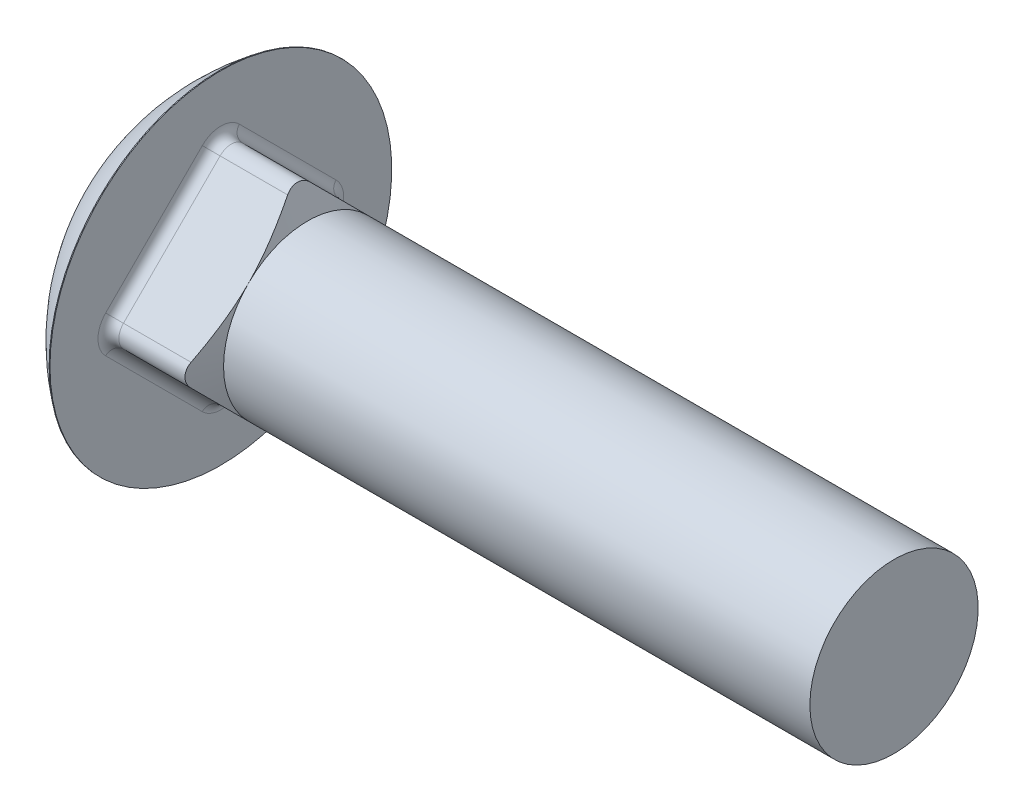
ISO-10303-21;
HEADER;
FILE_DESCRIPTION(('STEP AP214'),'2;1');
FILE_NAME('part.step','',(''),(''),'','','');
FILE_SCHEMA(('AUTOMOTIVE_DESIGN { 1 0 10303 214 1 1 1 1 }'));
ENDSEC;
DATA;
#1=APPLICATION_CONTEXT('core data for automotive mechanical design processes');
#2=APPLICATION_PROTOCOL_DEFINITION('international standard','automotive_design',2000,#1);
#3=PRODUCT_CONTEXT('',#1,'mechanical');
#4=PRODUCT('Part','Part','',(#3));
#5=PRODUCT_RELATED_PRODUCT_CATEGORY('part','',(#4));
#6=PRODUCT_DEFINITION_FORMATION('','',#4);
#7=PRODUCT_DEFINITION_CONTEXT('part definition',#1,'design');
#8=PRODUCT_DEFINITION('design','',#6,#7);
#9=PRODUCT_DEFINITION_SHAPE('','',#8);
#10=(LENGTH_UNIT() NAMED_UNIT(*) SI_UNIT(.MILLI.,.METRE.));
#11=(NAMED_UNIT(*) PLANE_ANGLE_UNIT() SI_UNIT($,.RADIAN.));
#12=(NAMED_UNIT(*) SI_UNIT($,.STERADIAN.) SOLID_ANGLE_UNIT());
#13=UNCERTAINTY_MEASURE_WITH_UNIT(LENGTH_MEASURE(1.E-05),#10,'distance_accuracy_value','');
#14=(GEOMETRIC_REPRESENTATION_CONTEXT(3) GLOBAL_UNCERTAINTY_ASSIGNED_CONTEXT((#13)) GLOBAL_UNIT_ASSIGNED_CONTEXT((#10,
#11,#12)) REPRESENTATION_CONTEXT('',''));
#15=CARTESIAN_POINT('',(0.,0.,0.));
#16=DIRECTION('',(0.,0.,1.));
#17=DIRECTION('',(1.,0.,0.));
#18=AXIS2_PLACEMENT_3D('',#15,#16,#17);
#19=CARTESIAN_POINT('',(26.2128,1.68828815076104,16.2722240913773));
#20=DIRECTION('',(0.,-0.707106781186549,-0.707106781186546));
#21=DIRECTION('',(0.,0.707106781186546,-0.707106781186549));
#22=AXIS2_PLACEMENT_3D('',#19,#20,#21);
#23=PLANE('',#22);
#24=CARTESIAN_POINT('',(24.8807598533623,16.2724240913773,1.68808815076099));
#25=CARTESIAN_POINT('',(24.9601596187108,16.027679443046,1.93283279909226));
#26=CARTESIAN_POINT('',(25.0372964743429,15.7825608306851,2.17795141145319));
#27=CARTESIAN_POINT('',(25.1863519545563,15.2915071602856,2.66900508185271));
#28=CARTESIAN_POINT('',(25.2582700555004,15.0455720229007,2.91494021923757));
#29=CARTESIAN_POINT('',(25.3962596155297,14.5525793097061,3.40793293243218));
#30=CARTESIAN_POINT('',(25.4623241778106,14.3055207611552,3.65499148098311));
#31=CARTESIAN_POINT('',(25.5877245665684,13.8105642338109,4.14994800832737));
#32=CARTESIAN_POINT('',(25.6470605654289,13.5626662766906,4.39784596544769));
#33=CARTESIAN_POINT('',(25.8136481210669,12.8180244249834,5.14248781715494));
#34=CARTESIAN_POINT('',(25.9095878668188,12.3199535127129,5.64055872942537));
#35=CARTESIAN_POINT('',(26.025872648822,11.5708306594036,6.38968158273473));
#36=CARTESIAN_POINT('',(26.0600269092489,11.3208263586745,6.63968588346382));
#37=CARTESIAN_POINT('',(26.1184380522218,10.8202440672077,7.14026817493059));
#38=CARTESIAN_POINT('',(26.142695466792,10.5696661080366,7.39084613410174));
#39=CARTESIAN_POINT('',(26.180348469974,10.073511899722,7.8870003424163));
#40=CARTESIAN_POINT('',(26.1939666672346,9.82794411562072,8.13256812651758));
#41=CARTESIAN_POINT('',(26.2108820586346,9.33663297906274,8.62387926307557));
#42=CARTESIAN_POINT('',(26.2141794189577,9.09088962949669,8.86962261264162));
#43=CARTESIAN_POINT('',(26.2103744175724,8.5994159899527,9.36109625218561));
#44=CARTESIAN_POINT('',(26.2032708897272,8.35368570452874,9.60682653760957));
#45=CARTESIAN_POINT('',(26.1788298938911,7.86247141083385,10.0980408313045));
#46=CARTESIAN_POINT('',(26.1614919867857,7.61698741358286,10.3435248285555));
#47=CARTESIAN_POINT('',(26.1169991090315,7.12672341932991,10.8337888228084));
#48=CARTESIAN_POINT('',(26.0898543861674,6.8819429553056,11.0785692868327));
#49=CARTESIAN_POINT('',(26.026322250456,6.39297863673103,11.5675336054073));
#50=CARTESIAN_POINT('',(25.9899343602927,6.14879481364889,11.8117174284894));
#51=CARTESIAN_POINT('',(25.867943900499,5.41729862688549,12.5432136152528));
#52=CARTESIAN_POINT('',(25.7695138650547,4.93103450402566,13.0294777381127));
#53=CARTESIAN_POINT('',(25.6035912681529,4.21576615242779,13.7447460897105));
#54=CARTESIAN_POINT('',(25.5469072009391,3.98545045550632,13.975061786632));
#55=CARTESIAN_POINT('',(25.4278711488906,3.52559153511491,14.4349207070234));
#56=CARTESIAN_POINT('',(25.3655202303654,3.29604817471245,14.6644640674259));
#57=CARTESIAN_POINT('',(25.2353958013607,2.83637288599368,15.1241393561446));
#58=CARTESIAN_POINT('',(25.1675933613905,2.60624508074445,15.3542671613939));
#59=CARTESIAN_POINT('',(25.0274428082715,2.14666509551387,15.8138471466245));
#60=CARTESIAN_POINT('',(24.955094383002,1.91721296305798,16.0432992790804));
#61=CARTESIAN_POINT('',(24.8807598533623,1.68808815076105,16.2724240913773));
#62=B_SPLINE_CURVE_WITH_KNOTS('',3,(#24,#25,#26,#27,#28,#29,#30,#31,#32,#33,#34,#35,#36,#37,#38,
#39,#40,#41,#42,#43,#44,#45,#46,#47,#48,#49,#50,#51,#52,#53,#54,#55,#56,#57,#58,#59,#60,#61),
.UNSPECIFIED.,.F.,.F.,(4,2,2,2,2,2,2,2,2,2,2,2,2,2,2,2,2,2,4),(0.,1.06534032984694,
2.1307874059939,3.19747357683502,4.26413241335449,6.39581036811954,7.46131492301681,
8.52676219210955,9.56927061595191,10.6117622534725,11.6543707830245,12.6970240498054,
13.7385909163741,14.7802115802637,16.8634229986616,17.8552276649387,18.8468460920229,
19.8441265311481,20.841475517107),.UNSPECIFIED.);
#63=CARTESIAN_POINT('',(24.8808247470218,16.2722240913773,1.68828815076098));
#64=VERTEX_POINT('',#63);
#65=CARTESIAN_POINT('',(26.2128,8.98025612106916,8.98025612106913));
#66=VERTEX_POINT('',#65);
#67=EDGE_CURVE('E51',#64,#66,#62,.T.);
#68=ORIENTED_EDGE('',*,*,#67,.F.);
#69=DIRECTION('',(-1.,0.,0.));
#70=VECTOR('',#69,1.);
#71=CARTESIAN_POINT('',(26.2128,16.2722240913773,1.68828815076098));
#72=LINE('',#71,#70);
#73=CARTESIAN_POINT('',(14.6812,16.2722240913773,1.68828815076098));
#74=VERTEX_POINT('',#73);
#75=EDGE_CURVE('E298',#64,#74,#72,.T.);
#76=ORIENTED_EDGE('',*,*,#75,.T.);
#77=DIRECTION('',(0.,0.707106781186546,-0.707106781186549));
#78=VECTOR('',#77,1.);
#79=CARTESIAN_POINT('',(14.6812,1.68828815076104,16.2722240913773));
#80=LINE('',#79,#78);
#81=CARTESIAN_POINT('',(14.6812,1.68828815076104,16.2722240913773));
#82=VERTEX_POINT('',#81);
#83=EDGE_CURVE('E43',#74,#82,#80,.F.);
#84=ORIENTED_EDGE('',*,*,#83,.T.);
#85=DIRECTION('',(-1.,0.,0.));
#86=VECTOR('',#85,1.);
#87=CARTESIAN_POINT('',(26.2128,1.68828815076104,16.2722240913773));
#88=LINE('',#87,#86);
#89=CARTESIAN_POINT('',(24.8808247470218,1.68828815076104,16.2722240913773));
#90=VERTEX_POINT('',#89);
#91=EDGE_CURVE('E306',#90,#82,#88,.T.);
#92=ORIENTED_EDGE('',*,*,#91,.F.);
#93=EDGE_CURVE('E227',#66,#90,#62,.T.);
#94=ORIENTED_EDGE('',*,*,#93,.F.);
#95=EDGE_LOOP('',(#68,#76,#84,#92,#94));
#96=FACE_BOUND('',#95,.T.);
#97=ADVANCED_FACE('F34',(#96),#23,.F.);
#98=CARTESIAN_POINT('',(26.2128,-16.2722240913773,1.68828815076104));
#99=DIRECTION('',(0.,0.707106781186546,-0.707106781186549));
#100=DIRECTION('',(0.,0.707106781186549,0.707106781186546));
#101=AXIS2_PLACEMENT_3D('',#98,#99,#100);
#102=PLANE('',#101);
#103=CARTESIAN_POINT('',(24.8807598533623,-1.68808815076098,16.2724240913773));
#104=CARTESIAN_POINT('',(24.9601596187108,-1.93283279909225,16.027679443046));
#105=CARTESIAN_POINT('',(25.0372964743429,-2.17795141145319,15.7825608306851));
#106=CARTESIAN_POINT('',(25.1863519545563,-2.6690050818527,15.2915071602856));
#107=CARTESIAN_POINT('',(25.2582700555004,-2.91494021923757,15.0455720229007));
#108=CARTESIAN_POINT('',(25.3962596155297,-3.40793293243218,14.5525793097061));
#109=CARTESIAN_POINT('',(25.4623241778106,-3.65499148098311,14.3055207611552));
#110=CARTESIAN_POINT('',(25.5877245665684,-4.14994800832737,13.8105642338109));
#111=CARTESIAN_POINT('',(25.6470605654289,-4.39784596544769,13.5626662766906));
#112=CARTESIAN_POINT('',(25.8136481210669,-5.14248781715494,12.8180244249834));
#113=CARTESIAN_POINT('',(25.9095878668188,-5.64055872942537,12.3199535127129));
#114=CARTESIAN_POINT('',(26.025872648822,-6.38968158273473,11.5708306594036));
#115=CARTESIAN_POINT('',(26.0600269092489,-6.63968588346382,11.3208263586745));
#116=CARTESIAN_POINT('',(26.1184380522218,-7.14026817493059,10.8202440672077));
#117=CARTESIAN_POINT('',(26.142695466792,-7.39084613410174,10.5696661080366));
#118=CARTESIAN_POINT('',(26.180348469974,-7.8870003424163,10.073511899722));
#119=CARTESIAN_POINT('',(26.1939666672346,-8.13256812651758,9.82794411562072));
#120=CARTESIAN_POINT('',(26.2108820586346,-8.62387926307557,9.33663297906274));
#121=CARTESIAN_POINT('',(26.2141794189577,-8.86962261264162,9.09088962949668));
#122=CARTESIAN_POINT('',(26.2103744175724,-9.36109625218561,8.5994159899527));
#123=CARTESIAN_POINT('',(26.2032708897272,-9.60682653760958,8.35368570452873));
#124=CARTESIAN_POINT('',(26.1788298938911,-10.0980408313045,7.86247141083385));
#125=CARTESIAN_POINT('',(26.1614919867857,-10.3435248285555,7.61698741358285));
#126=CARTESIAN_POINT('',(26.1169991090315,-10.8337888228084,7.12672341932991));
#127=CARTESIAN_POINT('',(26.0898543861674,-11.0785692868327,6.8819429553056));
#128=CARTESIAN_POINT('',(26.026322250456,-11.5675336054073,6.39297863673103));
#129=CARTESIAN_POINT('',(25.9899343602927,-11.8117174284894,6.14879481364888));
#130=CARTESIAN_POINT('',(25.867943900499,-12.5432136152528,5.41729862688549));
#131=CARTESIAN_POINT('',(25.7695138650547,-13.0294777381127,4.93103450402565));
#132=CARTESIAN_POINT('',(25.6035912681529,-13.7447460897105,4.21576615242778));
#133=CARTESIAN_POINT('',(25.5469072009391,-13.975061786632,3.98545045550631));
#134=CARTESIAN_POINT('',(25.4278711488906,-14.4349207070234,3.5255915351149));
#135=CARTESIAN_POINT('',(25.3655202303654,-14.6644640674259,3.29604817471244));
#136=CARTESIAN_POINT('',(25.2353958013607,-15.1241393561446,2.83637288599368));
#137=CARTESIAN_POINT('',(25.1675933613905,-15.3542671613939,2.60624508074445));
#138=CARTESIAN_POINT('',(25.0274428082715,-15.8138471466245,2.14666509551387));
#139=CARTESIAN_POINT('',(24.955094383002,-16.0432992790804,1.91721296305798));
#140=CARTESIAN_POINT('',(24.8807598533623,-16.2724240913773,1.68808815076104));
#141=B_SPLINE_CURVE_WITH_KNOTS('',3,(#103,#104,#105,#106,#107,#108,#109,#110,#111,#112,#113,
#114,#115,#116,#117,#118,#119,#120,#121,#122,#123,#124,#125,#126,#127,#128,#129,#130,#131,#132,
#133,#134,#135,#136,#137,#138,#139,#140),.UNSPECIFIED.,.F.,.F.,(4,2,2,2,2,2,2,2,2,2,2,2,2,2,2,2,
2,2,4),(0.,1.06534032984694,2.1307874059939,3.19747357683503,4.2641324133545,6.39581036811954,
7.46131492301682,8.52676219210956,9.56927061595192,10.6117622534725,11.6543707830245,
12.6970240498055,13.7385909163741,14.7802115802638,16.8634229986616,17.8552276649387,
18.8468460920229,19.8441265311481,20.841475517107),.UNSPECIFIED.);
#142=CARTESIAN_POINT('',(24.8808247470218,-1.68828815076098,16.2722240913773));
#143=VERTEX_POINT('',#142);
#144=CARTESIAN_POINT('',(26.2128,-8.98025612106912,8.98025612106915));
#145=VERTEX_POINT('',#144);
#146=EDGE_CURVE('E136',#143,#145,#141,.T.);
#147=ORIENTED_EDGE('',*,*,#146,.F.);
#148=DIRECTION('',(-1.,0.,0.));
#149=VECTOR('',#148,1.);
#150=CARTESIAN_POINT('',(26.2128,-1.68828815076098,16.2722240913773));
#151=LINE('',#150,#149);
#152=CARTESIAN_POINT('',(14.6812,-1.68828815076098,16.2722240913773));
#153=VERTEX_POINT('',#152);
#154=EDGE_CURVE('E311',#143,#153,#151,.T.);
#155=ORIENTED_EDGE('',*,*,#154,.T.);
#156=DIRECTION('',(0.,0.707106781186549,0.707106781186546));
#157=VECTOR('',#156,1.);
#158=CARTESIAN_POINT('',(14.6812,-16.2722240913773,1.68828815076104));
#159=LINE('',#158,#157);
#160=CARTESIAN_POINT('',(14.6812,-16.2722240913773,1.68828815076104));
#161=VERTEX_POINT('',#160);
#162=EDGE_CURVE('E341',#153,#161,#159,.F.);
#163=ORIENTED_EDGE('',*,*,#162,.T.);
#164=DIRECTION('',(-1.,0.,0.));
#165=VECTOR('',#164,1.);
#166=CARTESIAN_POINT('',(26.2128,-16.2722240913773,1.68828815076104));
#167=LINE('',#166,#165);
#168=CARTESIAN_POINT('',(24.8808247470218,-16.2722240913773,1.68828815076104));
#169=VERTEX_POINT('',#168);
#170=EDGE_CURVE('E171',#169,#161,#167,.T.);
#171=ORIENTED_EDGE('',*,*,#170,.F.);
#172=EDGE_CURVE('E147',#145,#169,#141,.T.);
#173=ORIENTED_EDGE('',*,*,#172,.F.);
#174=EDGE_LOOP('',(#147,#155,#163,#171,#173));
#175=FACE_BOUND('',#174,.T.);
#176=ADVANCED_FACE('F169',(#175),#102,.F.);
#177=CARTESIAN_POINT('',(26.2128,-16.2722240913773,-1.68828815076098));
#178=DIRECTION('',(0.,0.707106781186549,0.707106781186546));
#179=DIRECTION('',(0.,-0.707106781186546,0.707106781186549));
#180=AXIS2_PLACEMENT_3D('',#177,#178,#179);
#181=PLANE('',#180);
#182=CARTESIAN_POINT('',(24.8807598533623,-16.2724240913773,-1.68808815076099));
#183=CARTESIAN_POINT('',(24.9601596187108,-16.027679443046,-1.93283279909226));
#184=CARTESIAN_POINT('',(25.0372964743429,-15.7825608306851,-2.17795141145319));
#185=CARTESIAN_POINT('',(25.1863519545563,-15.2915071602856,-2.66900508185271));
#186=CARTESIAN_POINT('',(25.2582700555004,-15.0455720229007,-2.91494021923758));
#187=CARTESIAN_POINT('',(25.3962596155297,-14.5525793097061,-3.40793293243219));
#188=CARTESIAN_POINT('',(25.4623241778106,-14.3055207611552,-3.65499148098311));
#189=CARTESIAN_POINT('',(25.5877245665684,-13.8105642338109,-4.14994800832738));
#190=CARTESIAN_POINT('',(25.6470605654289,-13.5626662766906,-4.3978459654477));
#191=CARTESIAN_POINT('',(25.8136481210669,-12.8180244249833,-5.14248781715495));
#192=CARTESIAN_POINT('',(25.9095878668188,-12.3199535127129,-5.64055872942538));
#193=CARTESIAN_POINT('',(26.025872648822,-11.5708306594036,-6.38968158273473));
#194=CARTESIAN_POINT('',(26.0600269092489,-11.3208263586745,-6.63968588346382));
#195=CARTESIAN_POINT('',(26.1184380522218,-10.8202440672077,-7.1402681749306));
#196=CARTESIAN_POINT('',(26.142695466792,-10.5696661080366,-7.39084613410174));
#197=CARTESIAN_POINT('',(26.180348469974,-10.073511899722,-7.88700034241631));
#198=CARTESIAN_POINT('',(26.1939666672346,-9.82794411562071,-8.13256812651759));
#199=CARTESIAN_POINT('',(26.2108820586346,-9.33663297906273,-8.62387926307557));
#200=CARTESIAN_POINT('',(26.2141794189577,-9.09088962949668,-8.86962261264163));
#201=CARTESIAN_POINT('',(26.2103744175724,-8.59941598995269,-9.36109625218562));
#202=CARTESIAN_POINT('',(26.2032708897272,-8.35368570452873,-9.60682653760958));
#203=CARTESIAN_POINT('',(26.1788298938911,-7.86247141083384,-10.0980408313045));
#204=CARTESIAN_POINT('',(26.1614919867857,-7.61698741358284,-10.3435248285555));
#205=CARTESIAN_POINT('',(26.1169991090315,-7.12672341932989,-10.8337888228084));
#206=CARTESIAN_POINT('',(26.0898543861674,-6.88194295530559,-11.0785692868327));
#207=CARTESIAN_POINT('',(26.026322250456,-6.39297863673101,-11.5675336054073));
#208=CARTESIAN_POINT('',(25.9899343602927,-6.14879481364887,-11.8117174284894));
#209=CARTESIAN_POINT('',(25.867943900499,-5.41729862688548,-12.5432136152528));
#210=CARTESIAN_POINT('',(25.7695138650547,-4.93103450402564,-13.0294777381127));
#211=CARTESIAN_POINT('',(25.6035912681529,-4.21576615242777,-13.7447460897105));
#212=CARTESIAN_POINT('',(25.5469072009391,-3.9854504555063,-13.975061786632));
#213=CARTESIAN_POINT('',(25.4278711488906,-3.5255915351149,-14.4349207070234));
#214=CARTESIAN_POINT('',(25.3655202303654,-3.29604817471244,-14.6644640674259));
#215=CARTESIAN_POINT('',(25.2353958013607,-2.83637288599367,-15.1241393561446));
#216=CARTESIAN_POINT('',(25.1675933613905,-2.60624508074444,-15.3542671613939));
#217=CARTESIAN_POINT('',(25.0274428082715,-2.14666509551386,-15.8138471466245));
#218=CARTESIAN_POINT('',(24.955094383002,-1.91721296305798,-16.0432992790804));
#219=CARTESIAN_POINT('',(24.8807598533623,-1.68808815076104,-16.2724240913773));
#220=B_SPLINE_CURVE_WITH_KNOTS('',3,(#182,#183,#184,#185,#186,#187,#188,#189,#190,#191,#192,
#193,#194,#195,#196,#197,#198,#199,#200,#201,#202,#203,#204,#205,#206,#207,#208,#209,#210,#211,
#212,#213,#214,#215,#216,#217,#218,#219),.UNSPECIFIED.,.F.,.F.,(4,2,2,2,2,2,2,2,2,2,2,2,2,2,2,2,
2,2,4),(0.,1.06534032984694,2.1307874059939,3.19747357683503,4.2641324133545,6.39581036811955,
7.46131492301682,8.52676219210956,9.56927061595192,10.6117622534725,11.6543707830245,
12.6970240498055,13.7385909163741,14.7802115802638,16.8634229986616,17.8552276649387,
18.8468460920229,19.8441265311481,20.841475517107),.UNSPECIFIED.);
#221=CARTESIAN_POINT('',(24.8808247470218,-16.2722240913773,-1.68828815076099));
#222=VERTEX_POINT('',#221);
#223=CARTESIAN_POINT('',(26.2128,-8.98025612106915,-8.98025612106911));
#224=VERTEX_POINT('',#223);
#225=EDGE_CURVE('E156',#222,#224,#220,.T.);
#226=ORIENTED_EDGE('',*,*,#225,.F.);
#227=DIRECTION('',(-1.,0.,0.));
#228=VECTOR('',#227,1.);
#229=CARTESIAN_POINT('',(26.2128,-16.2722240913773,-1.68828815076098));
#230=LINE('',#229,#228);
#231=CARTESIAN_POINT('',(14.6812,-16.2722240913773,-1.68828815076098));
#232=VERTEX_POINT('',#231);
#233=EDGE_CURVE('E381',#222,#232,#230,.T.);
#234=ORIENTED_EDGE('',*,*,#233,.T.);
#235=DIRECTION('',(0.,-0.707106781186546,0.707106781186549));
#236=VECTOR('',#235,1.);
#237=CARTESIAN_POINT('',(14.6812,-16.2722240913773,-1.68828815076098));
#238=LINE('',#237,#236);
#239=CARTESIAN_POINT('',(14.6812,-1.68828815076104,-16.2722240913773));
#240=VERTEX_POINT('',#239);
#241=EDGE_CURVE('E338',#232,#240,#238,.F.);
#242=ORIENTED_EDGE('',*,*,#241,.T.);
#243=DIRECTION('',(-1.,0.,0.));
#244=VECTOR('',#243,1.);
#245=CARTESIAN_POINT('',(26.2128,-1.68828815076104,-16.2722240913773));
#246=LINE('',#245,#244);
#247=CARTESIAN_POINT('',(24.8808247470218,-1.68828815076104,-16.2722240913773));
#248=VERTEX_POINT('',#247);
#249=EDGE_CURVE('E377',#248,#240,#246,.T.);
#250=ORIENTED_EDGE('',*,*,#249,.F.);
#251=EDGE_CURVE('E215',#224,#248,#220,.T.);
#252=ORIENTED_EDGE('',*,*,#251,.F.);
#253=EDGE_LOOP('',(#226,#234,#242,#250,#252));
#254=FACE_BOUND('',#253,.T.);
#255=ADVANCED_FACE('F295',(#254),#181,.F.);
#256=CARTESIAN_POINT('',(26.2128,1.68828815076098,-16.2722240913773));
#257=DIRECTION('',(0.,-0.707106781186546,0.707106781186549));
#258=DIRECTION('',(0.,-0.707106781186549,-0.707106781186546));
#259=AXIS2_PLACEMENT_3D('',#256,#257,#258);
#260=PLANE('',#259);
#261=CARTESIAN_POINT('',(24.8807598533623,1.68808815076099,-16.2724240913773));
#262=CARTESIAN_POINT('',(24.9601596187108,1.93283279909226,-16.027679443046));
#263=CARTESIAN_POINT('',(25.0372964743429,2.17795141145319,-15.7825608306851));
#264=CARTESIAN_POINT('',(25.1863519545563,2.66900508185271,-15.2915071602856));
#265=CARTESIAN_POINT('',(25.2582700555004,2.91494021923758,-15.0455720229007));
#266=CARTESIAN_POINT('',(25.3962596155297,3.40793293243219,-14.5525793097061));
#267=CARTESIAN_POINT('',(25.4623241778106,3.65499148098311,-14.3055207611552));
#268=CARTESIAN_POINT('',(25.5877245665684,4.14994800832738,-13.8105642338109));
#269=CARTESIAN_POINT('',(25.6470605654289,4.3978459654477,-13.5626662766906));
#270=CARTESIAN_POINT('',(25.8136481210669,5.14248781715494,-12.8180244249833));
#271=CARTESIAN_POINT('',(25.9095878668188,5.64055872942538,-12.3199535127129));
#272=CARTESIAN_POINT('',(26.025872648822,6.38968158273473,-11.5708306594036));
#273=CARTESIAN_POINT('',(26.0600269092489,6.63968588346382,-11.3208263586745));
#274=CARTESIAN_POINT('',(26.1184380522218,7.14026817493059,-10.8202440672077));
#275=CARTESIAN_POINT('',(26.142695466792,7.39084613410174,-10.5696661080366));
#276=CARTESIAN_POINT('',(26.180348469974,7.8870003424163,-10.073511899722));
#277=CARTESIAN_POINT('',(26.1939666672346,8.13256812651759,-9.82794411562072));
#278=CARTESIAN_POINT('',(26.2108820586346,8.62387926307557,-9.33663297906273));
#279=CARTESIAN_POINT('',(26.2141794189577,8.86962261264163,-9.09088962949668));
#280=CARTESIAN_POINT('',(26.2103744175724,9.36109625218561,-8.59941598995269));
#281=CARTESIAN_POINT('',(26.2032708897272,9.60682653760958,-8.35368570452873));
#282=CARTESIAN_POINT('',(26.1788298938911,10.0980408313045,-7.86247141083384));
#283=CARTESIAN_POINT('',(26.1614919867857,10.3435248285555,-7.61698741358285));
#284=CARTESIAN_POINT('',(26.1169991090315,10.8337888228084,-7.1267234193299));
#285=CARTESIAN_POINT('',(26.0898543861674,11.0785692868327,-6.88194295530559));
#286=CARTESIAN_POINT('',(26.026322250456,11.5675336054073,-6.39297863673102));
#287=CARTESIAN_POINT('',(25.9899343602927,11.8117174284894,-6.14879481364888));
#288=CARTESIAN_POINT('',(25.867943900499,12.5432136152528,-5.41729862688548));
#289=CARTESIAN_POINT('',(25.7695138650547,13.0294777381127,-4.93103450402565));
#290=CARTESIAN_POINT('',(25.6035912681529,13.7447460897105,-4.21576615242778));
#291=CARTESIAN_POINT('',(25.5469072009391,13.975061786632,-3.98545045550631));
#292=CARTESIAN_POINT('',(25.4278711488906,14.4349207070234,-3.5255915351149));
#293=CARTESIAN_POINT('',(25.3655202303654,14.6644640674259,-3.29604817471244));
#294=CARTESIAN_POINT('',(25.2353958013607,15.1241393561446,-2.83637288599368));
#295=CARTESIAN_POINT('',(25.1675933613905,15.3542671613939,-2.60624508074445));
#296=CARTESIAN_POINT('',(25.0274428082715,15.8138471466245,-2.14666509551387));
#297=CARTESIAN_POINT('',(24.955094383002,16.0432992790804,-1.91721296305798));
#298=CARTESIAN_POINT('',(24.8807598533623,16.2724240913773,-1.68808815076104));
#299=B_SPLINE_CURVE_WITH_KNOTS('',3,(#261,#262,#263,#264,#265,#266,#267,#268,#269,#270,#271,
#272,#273,#274,#275,#276,#277,#278,#279,#280,#281,#282,#283,#284,#285,#286,#287,#288,#289,#290,
#291,#292,#293,#294,#295,#296,#297,#298),.UNSPECIFIED.,.F.,.F.,(4,2,2,2,2,2,2,2,2,2,2,2,2,2,2,2,
2,2,4),(0.,1.06534032984694,2.1307874059939,3.19747357683503,4.2641324133545,6.39581036811955,
7.46131492301682,8.52676219210956,9.56927061595192,10.6117622534725,11.6543707830245,
12.6970240498055,13.7385909163741,14.7802115802638,16.8634229986616,17.8552276649387,
18.8468460920229,19.8441265311481,20.841475517107),.UNSPECIFIED.);
#300=CARTESIAN_POINT('',(24.8808247470218,1.68828815076098,-16.2722240913773));
#301=VERTEX_POINT('',#300);
#302=CARTESIAN_POINT('',(26.2128,8.98025612106913,-8.98025612106916));
#303=VERTEX_POINT('',#302);
#304=EDGE_CURVE('E59',#301,#303,#299,.T.);
#305=ORIENTED_EDGE('',*,*,#304,.F.);
#306=DIRECTION('',(-1.,0.,0.));
#307=VECTOR('',#306,1.);
#308=CARTESIAN_POINT('',(26.2128,1.68828815076099,-16.2722240913773));
#309=LINE('',#308,#307);
#310=CARTESIAN_POINT('',(14.6812,1.68828815076099,-16.2722240913773));
#311=VERTEX_POINT('',#310);
#312=EDGE_CURVE('E376',#301,#311,#309,.T.);
#313=ORIENTED_EDGE('',*,*,#312,.T.);
#314=DIRECTION('',(0.,-0.707106781186549,-0.707106781186546));
#315=VECTOR('',#314,1.);
#316=CARTESIAN_POINT('',(14.6812,1.68828815076098,-16.2722240913773));
#317=LINE('',#316,#315);
#318=CARTESIAN_POINT('',(14.6812,16.2722240913773,-1.68828815076104));
#319=VERTEX_POINT('',#318);
#320=EDGE_CURVE('E349',#311,#319,#317,.F.);
#321=ORIENTED_EDGE('',*,*,#320,.T.);
#322=DIRECTION('',(-1.,0.,0.));
#323=VECTOR('',#322,1.);
#324=CARTESIAN_POINT('',(26.2128,16.2722240913773,-1.68828815076104));
#325=LINE('',#324,#323);
#326=CARTESIAN_POINT('',(24.8808247470218,16.2722240913773,-1.68828815076104));
#327=VERTEX_POINT('',#326);
#328=EDGE_CURVE('E373',#327,#319,#325,.T.);
#329=ORIENTED_EDGE('',*,*,#328,.F.);
#330=EDGE_CURVE('E172',#303,#327,#299,.T.);
#331=ORIENTED_EDGE('',*,*,#330,.F.);
#332=EDGE_LOOP('',(#305,#313,#321,#329,#331));
#333=FACE_BOUND('',#332,.T.);
#334=ADVANCED_FACE('F198',(#333),#260,.F.);
#335=CARTESIAN_POINT('',(26.2128,14.5839359406163,0.));
#336=DIRECTION('',(-1.,0.,0.));
#337=DIRECTION('',(0.,0.,1.));
#338=AXIS2_PLACEMENT_3D('',#335,#336,#337);
#339=CYLINDRICAL_SURFACE('',#338,2.3876);
#340=CARTESIAN_POINT('',(24.8808896404986,16.2720240913773,-1.68848812707121));
#341=CARTESIAN_POINT('',(24.8660448483892,16.3177753430586,-1.64275670128373));
#342=CARTESIAN_POINT('',(24.851827791654,16.361762599684,-1.59505328361676));
#343=CARTESIAN_POINT('',(24.8247272145423,16.4458829936523,-1.49599546437504));
#344=CARTESIAN_POINT('',(24.8118439074429,16.4860155145188,-1.44464048109419));
#345=CARTESIAN_POINT('',(24.7874879948975,16.5621032670757,-1.33856253568597));
#346=CARTESIAN_POINT('',(24.7760160517723,16.598056537106,-1.28383801024749));
#347=CARTESIAN_POINT('',(24.7545655353398,16.6654497401883,-1.17142448750147));
#348=CARTESIAN_POINT('',(24.7445868575009,16.6968899891549,-1.11373569807874));
#349=CARTESIAN_POINT('',(24.7169641146212,16.7841012794697,-0.936589912861833));
#350=CARTESIAN_POINT('',(24.7016488060925,16.8327143603866,-0.813120974339525));
#351=CARTESIAN_POINT('',(24.6777090080004,16.9088645931778,-0.55937260871198));
#352=CARTESIAN_POINT('',(24.6690801311428,16.9364155647703,-0.429097707341058));
#353=CARTESIAN_POINT('',(24.6588497979613,16.969094003842,-0.168677144679171));
#354=CARTESIAN_POINT('',(24.6570840551587,16.9747456760926,-0.0386039754328301));
#355=CARTESIAN_POINT('',(24.6601779620451,16.9648544607181,0.220660271653079));
#356=CARTESIAN_POINT('',(24.6650378943912,16.9493106688758,0.349851311623934));
#357=CARTESIAN_POINT('',(24.6811547048612,16.8979067576507,0.602126859007924));
#358=CARTESIAN_POINT('',(24.6923368917828,16.8622838677728,0.725264738245973));
#359=CARTESIAN_POINT('',(24.7207581984465,16.7721265366307,0.963690163726188));
#360=CARTESIAN_POINT('',(24.7379980396241,16.71758984284,1.07897677296935));
#361=CARTESIAN_POINT('',(24.7748152986535,16.6017799894422,1.28068997801959));
#362=CARTESIAN_POINT('',(24.7935510944967,16.5430617202392,1.36875489901984));
#363=CARTESIAN_POINT('',(24.8346090466483,16.4151052283586,1.53575852372608));
#364=CARTESIAN_POINT('',(24.8569262295323,16.3458816014689,1.61470962598212));
#365=CARTESIAN_POINT('',(24.8808896404988,16.2720240913766,1.68848812707181));
#366=B_SPLINE_CURVE_WITH_KNOTS('',3,(#340,#341,#342,#343,#344,#345,#346,#347,#348,#349,#350,
#351,#352,#353,#354,#355,#356,#357,#358,#359,#360,#361,#362,#363,#364,#365),.UNSPECIFIED.,.F.,
.F.,(4,2,2,2,2,2,2,2,2,2,2,2,4),(0.,0.199055821443422,0.398143424470166,0.597324101248632,
0.796490828433834,1.195074620887,1.59339666108396,1.9821229126108,2.37086574805941,
2.75510915881313,3.13939834649671,3.46092525910974,3.78200947508273),.UNSPECIFIED.);
#367=EDGE_CURVE('E222',#327,#64,#366,.T.);
#368=ORIENTED_EDGE('',*,*,#367,.F.);
#369=ORIENTED_EDGE('',*,*,#328,.T.);
#370=CARTESIAN_POINT('',(14.6812,14.5839359406163,0.));
#371=DIRECTION('',(1.,0.,0.));
#372=DIRECTION('',(0.,0.,-1.));
#373=AXIS2_PLACEMENT_3D('',#370,#371,#372);
#374=CIRCLE('',#373,2.3876);
#375=EDGE_CURVE('E11',#319,#74,#374,.T.);
#376=ORIENTED_EDGE('',*,*,#375,.T.);
#377=ORIENTED_EDGE('',*,*,#75,.F.);
#378=EDGE_LOOP('',(#368,#369,#376,#377));
#379=FACE_BOUND('',#378,.T.);
#380=ADVANCED_FACE('F233',(#379),#339,.T.);
#381=CARTESIAN_POINT('',(26.2128,0.,14.5839359406163));
#382=DIRECTION('',(-1.,0.,0.));
#383=DIRECTION('',(0.,0.,1.));
#384=AXIS2_PLACEMENT_3D('',#381,#382,#383);
#385=CYLINDRICAL_SURFACE('',#384,2.3876);
#386=CARTESIAN_POINT('',(24.880889648187,1.68848815076104,16.2720240676818));
#387=CARTESIAN_POINT('',(24.8660448558374,1.64275672557614,16.3177753200444));
#388=CARTESIAN_POINT('',(24.8518277988565,1.59505330848314,16.3617625773762));
#389=CARTESIAN_POINT('',(24.8247272212435,1.49599549032704,16.445882972803));
#390=CARTESIAN_POINT('',(24.8118439138886,1.4446405075578,16.4860154944216));
#391=CARTESIAN_POINT('',(24.7874880008232,1.33856256310435,16.5621032485247));
#392=CARTESIAN_POINT('',(24.7760160574337,1.28383803810891,16.5980565193488));
#393=CARTESIAN_POINT('',(24.7545655404661,1.17142451617691,16.6654497240526));
#394=CARTESIAN_POINT('',(24.7445868623563,1.11373572712519,16.6968899738469));
#395=CARTESIAN_POINT('',(24.7169641186554,0.936589942906161,16.7841012666889));
#396=CARTESIAN_POINT('',(24.7016488095685,0.813121004896634,16.8327143493479));
#397=CARTESIAN_POINT('',(24.6777090103556,0.559372639966159,16.908864585668));
#398=CARTESIAN_POINT('',(24.6690801329355,0.429097738779712,16.9364155590473));
#399=CARTESIAN_POINT('',(24.658849798657,0.168677176237677,16.9690940016164));
#400=CARTESIAN_POINT('',(24.6570840553155,0.0386040069364077,16.9747456755916));
#401=CARTESIAN_POINT('',(24.6601779611412,-0.2206602405555,16.9648544636076));
#402=CARTESIAN_POINT('',(24.6650378929651,-0.349851280877491,16.9493106734326));
#403=CARTESIAN_POINT('',(24.6811547024181,-0.602126829093252,16.8979067654351));
#404=CARTESIAN_POINT('',(24.6923368888371,-0.725264708813981,16.8622838771423));
#405=CARTESIAN_POINT('',(24.7207581945233,-0.963690135534798,16.7721265490506));
#406=CARTESIAN_POINT('',(24.7379980352271,-1.07897674553447,16.7175898567215));
#407=CARTESIAN_POINT('',(24.774815295129,-1.28068996150805,16.6017800004864));
#408=CARTESIAN_POINT('',(24.7935510927095,-1.36875489186376,16.5430617258052));
#409=CARTESIAN_POINT('',(24.8346090490719,-1.53575853347052,16.4151052208092));
#410=CARTESIAN_POINT('',(24.8569262344298,-1.61470964327061,16.3458815862811));
#411=CARTESIAN_POINT('',(24.880889648187,-1.68848815076098,16.2720240676819));
#412=B_SPLINE_CURVE_WITH_KNOTS('',3,(#386,#387,#388,#389,#390,#391,#392,#393,#394,#395,#396,
#397,#398,#399,#400,#401,#402,#403,#404,#405,#406,#407,#408,#409,#410,#411),.UNSPECIFIED.,.F.,
.F.,(4,2,2,2,2,2,2,2,2,2,2,2,4),(0.,0.199055821767764,0.398143425119546,0.597324102228397,
0.796490829743822,1.19507462286383,1.59339666372894,1.98212291566149,2.37086575149338,
2.75510916217797,3.1393983498627,3.46092529505114,3.78200954368105),.UNSPECIFIED.);
#413=EDGE_CURVE('E143',#90,#143,#412,.T.);
#414=ORIENTED_EDGE('',*,*,#413,.F.);
#415=ORIENTED_EDGE('',*,*,#91,.T.);
#416=CARTESIAN_POINT('',(14.6812,0.,14.5839359406163));
#417=DIRECTION('',(1.,0.,0.));
#418=DIRECTION('',(0.,0.,-1.));
#419=AXIS2_PLACEMENT_3D('',#416,#417,#418);
#420=CIRCLE('',#419,2.3876);
#421=EDGE_CURVE('E346',#82,#153,#420,.T.);
#422=ORIENTED_EDGE('',*,*,#421,.T.);
#423=ORIENTED_EDGE('',*,*,#154,.F.);
#424=EDGE_LOOP('',(#414,#415,#422,#423));
#425=FACE_BOUND('',#424,.T.);
#426=ADVANCED_FACE('F237',(#425),#385,.T.);
#427=CARTESIAN_POINT('',(26.2128,-14.5839359406163,0.));
#428=DIRECTION('',(-1.,0.,0.));
#429=DIRECTION('',(0.,0.,1.));
#430=AXIS2_PLACEMENT_3D('',#427,#428,#429);
#431=CYLINDRICAL_SURFACE('',#430,2.3876);
#432=CARTESIAN_POINT('',(24.8808896404988,-16.2720240913766,1.68848812707186));
#433=CARTESIAN_POINT('',(24.8660448483894,-16.317775343058,1.64275670128439));
#434=CARTESIAN_POINT('',(24.8518277916542,-16.3617625996834,1.59505328361744));
#435=CARTESIAN_POINT('',(24.8247272145425,-16.4458829936517,1.49599546437576));
#436=CARTESIAN_POINT('',(24.8118439074431,-16.4860155145182,1.44464048109491));
#437=CARTESIAN_POINT('',(24.7874879948976,-16.5621032670752,1.33856253568672));
#438=CARTESIAN_POINT('',(24.7760160517724,-16.5980565371055,1.28383801024826));
#439=CARTESIAN_POINT('',(24.75456553534,-16.6654497401879,1.17142448750225));
#440=CARTESIAN_POINT('',(24.744586857501,-16.6968899891545,1.11373569807954));
#441=CARTESIAN_POINT('',(24.7169641146213,-16.7841012794693,0.936589912862659));
#442=CARTESIAN_POINT('',(24.7016488060926,-16.8327143603863,0.813120974340364));
#443=CARTESIAN_POINT('',(24.6777090080004,-16.9088645931776,0.559372608712838));
#444=CARTESIAN_POINT('',(24.6690801311428,-16.9364155647702,0.429097707341922));
#445=CARTESIAN_POINT('',(24.6588497979613,-16.9690940038419,0.168677144680039));
#446=CARTESIAN_POINT('',(24.6570840551587,-16.9747456760926,0.0386039754336968));
#447=CARTESIAN_POINT('',(24.6601779620451,-16.9648544607182,-0.220660271652223));
#448=CARTESIAN_POINT('',(24.6650378943912,-16.9493106688759,-0.349851311623089));
#449=CARTESIAN_POINT('',(24.6811547048612,-16.897906757651,-0.602126859007102));
#450=CARTESIAN_POINT('',(24.6923368917827,-16.8622838677731,-0.725264738245164));
#451=CARTESIAN_POINT('',(24.7207581984464,-16.772126536631,-0.963690163725414));
#452=CARTESIAN_POINT('',(24.737998039624,-16.7175898428403,-1.0789767729686));
#453=CARTESIAN_POINT('',(24.7748152986533,-16.6017799894427,-1.28068997801887));
#454=CARTESIAN_POINT('',(24.7935510944965,-16.5430617202397,-1.36875489901913));
#455=CARTESIAN_POINT('',(24.8346090466481,-16.4151052283592,-1.53575852372539));
#456=CARTESIAN_POINT('',(24.8569262295321,-16.3458816014696,-1.61470962598145));
#457=CARTESIAN_POINT('',(24.8808896404986,-16.2720240913773,-1.68848812707116));
#458=B_SPLINE_CURVE_WITH_KNOTS('',3,(#432,#433,#434,#435,#436,#437,#438,#439,#440,#441,#442,
#443,#444,#445,#446,#447,#448,#449,#450,#451,#452,#453,#454,#455,#456,#457),.UNSPECIFIED.,.F.,
.F.,(4,2,2,2,2,2,2,2,2,2,2,2,4),(0.,0.199055821443427,0.398143424470184,0.597324101248657,
0.796490828433869,1.19507462088705,1.59339666108404,1.98212291261088,2.3708657480595,
2.75510915881322,3.1393983464968,3.46092525910979,3.78200947508272),.UNSPECIFIED.);
#459=EDGE_CURVE('E173',#169,#222,#458,.T.);
#460=ORIENTED_EDGE('',*,*,#459,.F.);
#461=ORIENTED_EDGE('',*,*,#170,.T.);
#462=CARTESIAN_POINT('',(14.6812,-14.5839359406163,0.));
#463=DIRECTION('',(1.,0.,0.));
#464=DIRECTION('',(0.,0.,-1.));
#465=AXIS2_PLACEMENT_3D('',#462,#463,#464);
#466=CIRCLE('',#465,2.3876);
#467=EDGE_CURVE('E160',#161,#232,#466,.T.);
#468=ORIENTED_EDGE('',*,*,#467,.T.);
#469=ORIENTED_EDGE('',*,*,#233,.F.);
#470=EDGE_LOOP('',(#460,#461,#468,#469));
#471=FACE_BOUND('',#470,.T.);
#472=ADVANCED_FACE('F396',(#471),#431,.T.);
#473=CARTESIAN_POINT('',(26.2128,0.,-14.5839359406163));
#474=DIRECTION('',(-1.,0.,0.));
#475=DIRECTION('',(0.,0.,1.));
#476=AXIS2_PLACEMENT_3D('',#473,#474,#475);
#477=CYLINDRICAL_SURFACE('',#476,2.3876);
#478=CARTESIAN_POINT('',(24.880889648187,-1.68848815076104,-16.2720240676818));
#479=CARTESIAN_POINT('',(24.8660448558374,-1.64275672557614,-16.3177753200444));
#480=CARTESIAN_POINT('',(24.8518277988565,-1.59505330848314,-16.3617625773762));
#481=CARTESIAN_POINT('',(24.8247272212435,-1.49599549032703,-16.445882972803));
#482=CARTESIAN_POINT('',(24.8118439138886,-1.4446405075578,-16.4860154944216));
#483=CARTESIAN_POINT('',(24.7874880008232,-1.33856256310435,-16.5621032485247));
#484=CARTESIAN_POINT('',(24.7760160574338,-1.28383803810891,-16.5980565193488));
#485=CARTESIAN_POINT('',(24.7545655404661,-1.17142451617691,-16.6654497240526));
#486=CARTESIAN_POINT('',(24.7445868623563,-1.11373572712519,-16.6968899738469));
#487=CARTESIAN_POINT('',(24.7169641186554,-0.936589942906161,-16.7841012666889));
#488=CARTESIAN_POINT('',(24.7016488095685,-0.813121004896634,-16.8327143493479));
#489=CARTESIAN_POINT('',(24.6777090103556,-0.559372639966159,-16.908864585668));
#490=CARTESIAN_POINT('',(24.6690801329355,-0.429097738779712,-16.9364155590473));
#491=CARTESIAN_POINT('',(24.658849798657,-0.168677176237677,-16.9690940016164));
#492=CARTESIAN_POINT('',(24.6570840553155,-0.0386040069364083,-16.9747456755916));
#493=CARTESIAN_POINT('',(24.6601779611412,0.220660240555499,-16.9648544636076));
#494=CARTESIAN_POINT('',(24.6650378929651,0.34985128087749,-16.9493106734326));
#495=CARTESIAN_POINT('',(24.6811547024181,0.602126829093251,-16.8979067654351));
#496=CARTESIAN_POINT('',(24.6923368888371,0.72526470881398,-16.8622838771423));
#497=CARTESIAN_POINT('',(24.7207581945233,0.963690135534797,-16.7721265490506));
#498=CARTESIAN_POINT('',(24.7379980352271,1.07897674553447,-16.7175898567215));
#499=CARTESIAN_POINT('',(24.774815295129,1.28068996150805,-16.6017800004864));
#500=CARTESIAN_POINT('',(24.7935510927095,1.36875489186376,-16.5430617258052));
#501=CARTESIAN_POINT('',(24.8346090490719,1.53575853347053,-16.4151052208092));
#502=CARTESIAN_POINT('',(24.8569262344298,1.61470964327061,-16.3458815862811));
#503=CARTESIAN_POINT('',(24.880889648187,1.68848815076099,-16.2720240676818));
#504=B_SPLINE_CURVE_WITH_KNOTS('',3,(#478,#479,#480,#481,#482,#483,#484,#485,#486,#487,#488,
#489,#490,#491,#492,#493,#494,#495,#496,#497,#498,#499,#500,#501,#502,#503),.UNSPECIFIED.,.F.,
.F.,(4,2,2,2,2,2,2,2,2,2,2,2,4),(0.,0.199055821767766,0.398143425119546,0.597324102228396,
0.796490829743821,1.19507462286383,1.59339666372894,1.98212291566148,2.37086575149337,
2.75510916217797,3.1393983498627,3.46092529505114,3.78200954368105),.UNSPECIFIED.);
#505=EDGE_CURVE('E204',#248,#301,#504,.T.);
#506=ORIENTED_EDGE('',*,*,#505,.F.);
#507=ORIENTED_EDGE('',*,*,#249,.T.);
#508=CARTESIAN_POINT('',(14.6812,0.,-14.5839359406163));
#509=DIRECTION('',(1.,0.,0.));
#510=DIRECTION('',(0.,0.,-1.));
#511=AXIS2_PLACEMENT_3D('',#508,#509,#510);
#512=CIRCLE('',#511,2.3876);
#513=EDGE_CURVE('E343',#240,#311,#512,.T.);
#514=ORIENTED_EDGE('',*,*,#513,.T.);
#515=ORIENTED_EDGE('',*,*,#312,.F.);
#516=EDGE_LOOP('',(#506,#507,#514,#515));
#517=FACE_BOUND('',#516,.T.);
#518=ADVANCED_FACE('F248',(#517),#477,.T.);
#519=CARTESIAN_POINT('',(13.1064,25.7937,0.));
#520=DIRECTION('',(1.,0.,0.));
#521=DIRECTION('',(0.,0.,-1.));
#522=AXIS2_PLACEMENT_3D('',#519,#520,#521);
#523=PLANE('',#522);
#524=DIRECTION('',(0.,-0.707106781186546,0.707106781186549));
#525=VECTOR('',#524,1.);
#526=CARTESIAN_POINT('',(13.1064,2.80304211991821,-22.9906578800817));
#527=LINE('',#526,#525);
#528=CARTESIAN_POINT('',(13.1064,-2.80183990977362,-17.3857758503899));
#529=VERTEX_POINT('',#528);
#530=CARTESIAN_POINT('',(13.1064,-17.3857758503899,-2.80183990977356));
#531=VERTEX_POINT('',#530);
#532=EDGE_CURVE('E333',#529,#531,#527,.T.);
#533=ORIENTED_EDGE('',*,*,#532,.T.);
#534=CARTESIAN_POINT('',(13.1064,-14.5839359406163,0.));
#535=DIRECTION('',(1.,0.,0.));
#536=DIRECTION('',(0.,0.,-1.));
#537=AXIS2_PLACEMENT_3D('',#534,#535,#536);
#538=CIRCLE('',#537,3.9624);
#539=CARTESIAN_POINT('',(13.1064,-17.3857758503899,2.80183990977363));
#540=VERTEX_POINT('',#539);
#541=EDGE_CURVE('E335',#531,#540,#538,.F.);
#542=ORIENTED_EDGE('',*,*,#541,.T.);
#543=DIRECTION('',(0.,0.707106781186549,0.707106781186546));
#544=VECTOR('',#543,1.);
#545=CARTESIAN_POINT('',(13.1064,2.80304211991833,22.9906578800817));
#546=LINE('',#545,#544);
#547=CARTESIAN_POINT('',(13.1064,-2.80183990977356,17.3857758503899));
#548=VERTEX_POINT('',#547);
#549=EDGE_CURVE('E331',#540,#548,#546,.T.);
#550=ORIENTED_EDGE('',*,*,#549,.T.);
#551=CARTESIAN_POINT('',(13.1064,0.,14.5839359406163));
#552=DIRECTION('',(1.,0.,0.));
#553=DIRECTION('',(0.,0.,-1.));
#554=AXIS2_PLACEMENT_3D('',#551,#552,#553);
#555=CIRCLE('',#554,3.9624);
#556=CARTESIAN_POINT('',(13.1064,2.80183990977363,17.3857758503899));
#557=VERTEX_POINT('',#556);
#558=EDGE_CURVE('E327',#548,#557,#555,.F.);
#559=ORIENTED_EDGE('',*,*,#558,.T.);
#560=DIRECTION('',(0.,0.707106781186546,-0.707106781186549));
#561=VECTOR('',#560,1.);
#562=CARTESIAN_POINT('',(13.1064,22.9906578800817,-2.80304211991829));
#563=LINE('',#562,#561);
#564=CARTESIAN_POINT('',(13.1064,17.3857758503899,2.80183990977356));
#565=VERTEX_POINT('',#564);
#566=EDGE_CURVE('E323',#557,#565,#563,.T.);
#567=ORIENTED_EDGE('',*,*,#566,.T.);
#568=CARTESIAN_POINT('',(13.1064,14.5839359406163,0.));
#569=DIRECTION('',(1.,0.,0.));
#570=DIRECTION('',(0.,0.,-1.));
#571=AXIS2_PLACEMENT_3D('',#568,#569,#570);
#572=CIRCLE('',#571,3.9624);
#573=CARTESIAN_POINT('',(13.1064,17.3857758503899,-2.80183990977362));
#574=VERTEX_POINT('',#573);
#575=EDGE_CURVE('E321',#565,#574,#572,.F.);
#576=ORIENTED_EDGE('',*,*,#575,.T.);
#577=DIRECTION('',(0.,-0.707106781186549,-0.707106781186546));
#578=VECTOR('',#577,1.);
#579=CARTESIAN_POINT('',(13.1064,22.9906578800818,2.80304211991826));
#580=LINE('',#579,#578);
#581=CARTESIAN_POINT('',(13.1064,2.80183990977356,-17.3857758503899));
#582=VERTEX_POINT('',#581);
#583=EDGE_CURVE('E325',#574,#582,#580,.T.);
#584=ORIENTED_EDGE('',*,*,#583,.T.);
#585=CARTESIAN_POINT('',(13.1064,0.,-14.5839359406163));
#586=DIRECTION('',(1.,0.,0.));
#587=DIRECTION('',(0.,0.,-1.));
#588=AXIS2_PLACEMENT_3D('',#585,#586,#587);
#589=CIRCLE('',#588,3.9624);
#590=EDGE_CURVE('E329',#582,#529,#589,.F.);
#591=ORIENTED_EDGE('',*,*,#590,.T.);
#592=EDGE_LOOP('',(#533,#542,#550,#559,#567,#576,#584,#591));
#593=FACE_BOUND('',#592,.T.);
#594=CARTESIAN_POINT('',(13.1064,0.,0.));
#595=DIRECTION('',(-1.,0.,0.));
#596=DIRECTION('',(0.,0.,1.));
#597=AXIS2_PLACEMENT_3D('',#594,#595,#596);
#598=CIRCLE('',#597,25.7937);
#599=CARTESIAN_POINT('',(13.1064,0.,25.7937));
#600=VERTEX_POINT('',#599);
#601=EDGE_CURVE('E309',#600,#600,#598,.T.);
#602=ORIENTED_EDGE('',*,*,#601,.F.);
#603=EDGE_LOOP('',(#602));
#604=FACE_BOUND('',#603,.T.);
#605=ADVANCED_FACE('F245',(#593,#604),#523,.T.);
#606=CARTESIAN_POINT('',(32.1193500489237,0.,0.));
#607=DIRECTION('',(-1.,0.,0.));
#608=DIRECTION('',(0.,1.,0.));
#609=AXIS2_PLACEMENT_3D('',#606,#607,#608);
#610=SPHERICAL_SURFACE('',#609,32.1193500489237);
#611=CARTESIAN_POINT('',(12.9794,0.,0.));
#612=DIRECTION('',(-1.,0.,0.));
#613=DIRECTION('',(0.,0.,1.));
#614=AXIS2_PLACEMENT_3D('',#611,#612,#613);
#615=CIRCLE('',#614,25.7937);
#616=CARTESIAN_POINT('',(12.9794,0.,25.7937));
#617=VERTEX_POINT('',#616);
#618=EDGE_CURVE('E305',#617,#617,#615,.T.);
#619=ORIENTED_EDGE('',*,*,#618,.T.);
#620=EDGE_LOOP('',(#619));
#621=FACE_BOUND('',#620,.T.);
#622=ADVANCED_FACE('F243',(#621),#610,.T.);
#623=CARTESIAN_POINT('',(0.,0.,0.));
#624=DIRECTION('',(-1.,0.,0.));
#625=DIRECTION('',(0.,0.,1.));
#626=AXIS2_PLACEMENT_3D('',#623,#624,#625);
#627=CYLINDRICAL_SURFACE('',#626,25.7937);
#628=ORIENTED_EDGE('',*,*,#618,.F.);
#629=EDGE_LOOP('',(#628));
#630=FACE_BOUND('',#629,.T.);
#631=ORIENTED_EDGE('',*,*,#601,.T.);
#632=EDGE_LOOP('',(#631));
#633=FACE_BOUND('',#632,.T.);
#634=ADVANCED_FACE('F240',(#630,#633),#627,.T.);
#635=CARTESIAN_POINT('',(14.6812,14.5839359406163,0.));
#636=DIRECTION('',(1.,0.,0.));
#637=DIRECTION('',(0.,0.,-1.));
#638=AXIS2_PLACEMENT_3D('',#635,#636,#637);
#639=TOROIDAL_SURFACE('',#638,3.9624,1.5748);
#640=CARTESIAN_POINT('',(14.6812,17.3857758503899,-2.80183990977362));
#641=DIRECTION('',(0.,0.707106781186549,0.707106781186546));
#642=DIRECTION('',(0.,-0.707106781186546,0.707106781186549));
#643=AXIS2_PLACEMENT_3D('',#640,#641,#642);
#644=CIRCLE('',#643,1.5748);
#645=EDGE_CURVE('E368',#574,#319,#644,.T.);
#646=ORIENTED_EDGE('',*,*,#645,.F.);
#647=ORIENTED_EDGE('',*,*,#575,.F.);
#648=CARTESIAN_POINT('',(14.6812,17.3857758503899,2.80183990977357));
#649=DIRECTION('',(0.,0.707106781186551,-0.707106781186544));
#650=DIRECTION('',(0.,0.707106781186544,0.707106781186551));
#651=AXIS2_PLACEMENT_3D('',#648,#649,#650);
#652=CIRCLE('',#651,1.5748);
#653=EDGE_CURVE('E38',#74,#565,#652,.T.);
#654=ORIENTED_EDGE('',*,*,#653,.F.);
#655=ORIENTED_EDGE('',*,*,#375,.F.);
#656=EDGE_LOOP('',(#646,#647,#654,#655));
#657=FACE_BOUND('',#656,.T.);
#658=ADVANCED_FACE('F36',(#657),#639,.F.);
#659=CARTESIAN_POINT('',(14.6812,22.9906578800817,-2.80304211991829));
#660=DIRECTION('',(0.,0.707106781186546,-0.707106781186549));
#661=DIRECTION('',(0.,0.707106781186549,0.707106781186546));
#662=AXIS2_PLACEMENT_3D('',#659,#660,#661);
#663=CYLINDRICAL_SURFACE('',#662,1.5748);
#664=ORIENTED_EDGE('',*,*,#653,.T.);
#665=ORIENTED_EDGE('',*,*,#566,.F.);
#666=CARTESIAN_POINT('',(14.6812,2.80183990977362,17.3857758503899));
#667=DIRECTION('',(0.,0.707106781186546,-0.707106781186549));
#668=DIRECTION('',(0.,0.707106781186549,0.707106781186546));
#669=AXIS2_PLACEMENT_3D('',#666,#667,#668);
#670=CIRCLE('',#669,1.5748);
#671=EDGE_CURVE('E366',#82,#557,#670,.T.);
#672=ORIENTED_EDGE('',*,*,#671,.F.);
#673=ORIENTED_EDGE('',*,*,#83,.F.);
#674=EDGE_LOOP('',(#664,#665,#672,#673));
#675=FACE_BOUND('',#674,.T.);
#676=ADVANCED_FACE('F281',(#675),#663,.F.);
#677=CARTESIAN_POINT('',(14.6812,22.9906578800818,2.80304211991826));
#678=DIRECTION('',(0.,-0.707106781186549,-0.707106781186546));
#679=DIRECTION('',(0.,0.707106781186546,-0.707106781186549));
#680=AXIS2_PLACEMENT_3D('',#677,#678,#679);
#681=CYLINDRICAL_SURFACE('',#680,1.5748);
#682=ORIENTED_EDGE('',*,*,#645,.T.);
#683=ORIENTED_EDGE('',*,*,#320,.F.);
#684=CARTESIAN_POINT('',(14.6812,2.80183990977356,-17.3857758503899));
#685=DIRECTION('',(0.,0.707106781186543,0.707106781186552));
#686=DIRECTION('',(0.,-0.707106781186552,0.707106781186543));
#687=AXIS2_PLACEMENT_3D('',#684,#685,#686);
#688=CIRCLE('',#687,1.5748);
#689=EDGE_CURVE('E363',#582,#311,#688,.T.);
#690=ORIENTED_EDGE('',*,*,#689,.F.);
#691=ORIENTED_EDGE('',*,*,#583,.F.);
#692=EDGE_LOOP('',(#682,#683,#690,#691));
#693=FACE_BOUND('',#692,.T.);
#694=ADVANCED_FACE('F278',(#693),#681,.F.);
#695=CARTESIAN_POINT('',(14.6812,0.,14.5839359406163));
#696=DIRECTION('',(1.,0.,0.));
#697=DIRECTION('',(0.,0.,-1.));
#698=AXIS2_PLACEMENT_3D('',#695,#696,#697);
#699=TOROIDAL_SURFACE('',#698,3.9624,1.5748);
#700=ORIENTED_EDGE('',*,*,#671,.T.);
#701=ORIENTED_EDGE('',*,*,#558,.F.);
#702=CARTESIAN_POINT('',(14.6812,-2.80183990977356,17.3857758503899));
#703=DIRECTION('',(0.,0.707106781186544,0.707106781186551));
#704=DIRECTION('',(0.,-0.707106781186551,0.707106781186544));
#705=AXIS2_PLACEMENT_3D('',#702,#703,#704);
#706=CIRCLE('',#705,1.5748);
#707=EDGE_CURVE('E360',#153,#548,#706,.T.);
#708=ORIENTED_EDGE('',*,*,#707,.F.);
#709=ORIENTED_EDGE('',*,*,#421,.F.);
#710=EDGE_LOOP('',(#700,#701,#708,#709));
#711=FACE_BOUND('',#710,.T.);
#712=ADVANCED_FACE('F274',(#711),#699,.F.);
#713=CARTESIAN_POINT('',(14.6812,0.,-14.5839359406163));
#714=DIRECTION('',(1.,0.,0.));
#715=DIRECTION('',(0.,0.,-1.));
#716=AXIS2_PLACEMENT_3D('',#713,#714,#715);
#717=TOROIDAL_SURFACE('',#716,3.9624,1.5748);
#718=ORIENTED_EDGE('',*,*,#689,.T.);
#719=ORIENTED_EDGE('',*,*,#513,.F.);
#720=CARTESIAN_POINT('',(14.6812,-2.80183990977362,-17.3857758503899));
#721=DIRECTION('',(0.,0.707106781186546,-0.707106781186549));
#722=DIRECTION('',(0.,0.707106781186549,0.707106781186546));
#723=AXIS2_PLACEMENT_3D('',#720,#721,#722);
#724=CIRCLE('',#723,1.5748);
#725=EDGE_CURVE('E357',#529,#240,#724,.T.);
#726=ORIENTED_EDGE('',*,*,#725,.F.);
#727=ORIENTED_EDGE('',*,*,#590,.F.);
#728=EDGE_LOOP('',(#718,#719,#726,#727));
#729=FACE_BOUND('',#728,.T.);
#730=ADVANCED_FACE('F270',(#729),#717,.F.);
#731=CARTESIAN_POINT('',(14.6812,2.80304211991833,22.9906578800817));
#732=DIRECTION('',(0.,0.707106781186549,0.707106781186546));
#733=DIRECTION('',(0.,-0.707106781186546,0.707106781186549));
#734=AXIS2_PLACEMENT_3D('',#731,#732,#733);
#735=CYLINDRICAL_SURFACE('',#734,1.5748);
#736=ORIENTED_EDGE('',*,*,#707,.T.);
#737=ORIENTED_EDGE('',*,*,#549,.F.);
#738=CARTESIAN_POINT('',(14.6812,-17.3857758503899,2.80183990977362));
#739=DIRECTION('',(0.,0.707106781186549,0.707106781186546));
#740=DIRECTION('',(0.,-0.707106781186546,0.707106781186549));
#741=AXIS2_PLACEMENT_3D('',#738,#739,#740);
#742=CIRCLE('',#741,1.5748);
#743=EDGE_CURVE('E355',#161,#540,#742,.T.);
#744=ORIENTED_EDGE('',*,*,#743,.F.);
#745=ORIENTED_EDGE('',*,*,#162,.F.);
#746=EDGE_LOOP('',(#736,#737,#744,#745));
#747=FACE_BOUND('',#746,.T.);
#748=ADVANCED_FACE('F266',(#747),#735,.F.);
#749=CARTESIAN_POINT('',(14.6812,2.80304211991821,-22.9906578800817));
#750=DIRECTION('',(0.,-0.707106781186546,0.707106781186549));
#751=DIRECTION('',(0.,-0.707106781186549,-0.707106781186546));
#752=AXIS2_PLACEMENT_3D('',#749,#750,#751);
#753=CYLINDRICAL_SURFACE('',#752,1.5748);
#754=ORIENTED_EDGE('',*,*,#725,.T.);
#755=ORIENTED_EDGE('',*,*,#241,.F.);
#756=CARTESIAN_POINT('',(14.6812,-17.3857758503899,-2.80183990977356));
#757=DIRECTION('',(0.,0.707106781186552,-0.707106781186543));
#758=DIRECTION('',(0.,0.707106781186543,0.707106781186552));
#759=AXIS2_PLACEMENT_3D('',#756,#757,#758);
#760=CIRCLE('',#759,1.5748);
#761=EDGE_CURVE('E300',#531,#232,#760,.T.);
#762=ORIENTED_EDGE('',*,*,#761,.F.);
#763=ORIENTED_EDGE('',*,*,#532,.F.);
#764=EDGE_LOOP('',(#754,#755,#762,#763));
#765=FACE_BOUND('',#764,.T.);
#766=ADVANCED_FACE('F262',(#765),#753,.F.);
#767=CARTESIAN_POINT('',(14.6812,-14.5839359406163,0.));
#768=DIRECTION('',(1.,0.,0.));
#769=DIRECTION('',(0.,0.,-1.));
#770=AXIS2_PLACEMENT_3D('',#767,#768,#769);
#771=TOROIDAL_SURFACE('',#770,3.9624,1.5748);
#772=ORIENTED_EDGE('',*,*,#743,.T.);
#773=ORIENTED_EDGE('',*,*,#541,.F.);
#774=ORIENTED_EDGE('',*,*,#761,.T.);
#775=ORIENTED_EDGE('',*,*,#467,.F.);
#776=EDGE_LOOP('',(#772,#773,#774,#775));
#777=FACE_BOUND('',#776,.T.);
#778=ADVANCED_FACE('F259',(#777),#771,.F.);
#779=CARTESIAN_POINT('',(16.8246609684078,0.,0.));
#780=DIRECTION('',(-1.,0.,0.));
#781=DIRECTION('',(0.,-1.,0.));
#782=AXIS2_PLACEMENT_3D('',#779,#780,#781);
#783=CONICAL_SURFACE('',#782,38.4937,1.22173047639603);
#784=ORIENTED_EDGE('',*,*,#172,.T.);
#785=ORIENTED_EDGE('',*,*,#459,.T.);
#786=ORIENTED_EDGE('',*,*,#225,.T.);
#787=CARTESIAN_POINT('',(26.2128,0.,0.));
#788=DIRECTION('',(-1.,0.,0.));
#789=DIRECTION('',(0.,0.,1.));
#790=AXIS2_PLACEMENT_3D('',#787,#788,#789);
#791=CIRCLE('',#790,12.7);
#792=EDGE_CURVE('E152',#145,#224,#791,.F.);
#793=ORIENTED_EDGE('',*,*,#792,.F.);
#794=EDGE_LOOP('',(#784,#785,#786,#793));
#795=FACE_BOUND('',#794,.T.);
#796=ADVANCED_FACE('F153',(#795),#783,.T.);
#797=ORIENTED_EDGE('',*,*,#251,.T.);
#798=ORIENTED_EDGE('',*,*,#505,.T.);
#799=ORIENTED_EDGE('',*,*,#304,.T.);
#800=EDGE_CURVE('E161',#224,#303,#791,.F.);
#801=ORIENTED_EDGE('',*,*,#800,.F.);
#802=EDGE_LOOP('',(#797,#798,#799,#801));
#803=FACE_BOUND('',#802,.T.);
#804=ADVANCED_FACE('F197',(#803),#783,.T.);
#805=ORIENTED_EDGE('',*,*,#67,.T.);
#806=EDGE_CURVE('E165',#303,#66,#791,.F.);
#807=ORIENTED_EDGE('',*,*,#806,.F.);
#808=ORIENTED_EDGE('',*,*,#330,.T.);
#809=ORIENTED_EDGE('',*,*,#367,.T.);
#810=EDGE_LOOP('',(#805,#807,#808,#809));
#811=FACE_BOUND('',#810,.T.);
#812=ADVANCED_FACE('F193',(#811),#783,.T.);
#813=ORIENTED_EDGE('',*,*,#93,.T.);
#814=ORIENTED_EDGE('',*,*,#413,.T.);
#815=ORIENTED_EDGE('',*,*,#146,.T.);
#816=EDGE_CURVE('E140',#66,#145,#791,.F.);
#817=ORIENTED_EDGE('',*,*,#816,.F.);
#818=EDGE_LOOP('',(#813,#814,#815,#817));
#819=FACE_BOUND('',#818,.T.);
#820=ADVANCED_FACE('F138',(#819),#783,.T.);
#821=CARTESIAN_POINT('',(114.7064,12.7,0.));
#822=DIRECTION('',(1.,0.,0.));
#823=DIRECTION('',(0.,0.,-1.));
#824=AXIS2_PLACEMENT_3D('',#821,#822,#823);
#825=PLANE('',#824);
#826=CARTESIAN_POINT('',(114.7064,0.,0.));
#827=DIRECTION('',(-1.,0.,0.));
#828=DIRECTION('',(0.,0.,1.));
#829=AXIS2_PLACEMENT_3D('',#826,#827,#828);
#830=CIRCLE('',#829,12.7);
#831=CARTESIAN_POINT('',(114.7064,0.,12.7));
#832=VERTEX_POINT('',#831);
#833=EDGE_CURVE('E167',#832,#832,#830,.T.);
#834=ORIENTED_EDGE('',*,*,#833,.F.);
#835=EDGE_LOOP('',(#834));
#836=FACE_BOUND('',#835,.T.);
#837=ADVANCED_FACE('F252',(#836),#825,.T.);
#838=CARTESIAN_POINT('',(0.,0.,0.));
#839=DIRECTION('',(-1.,0.,0.));
#840=DIRECTION('',(0.,0.,1.));
#841=AXIS2_PLACEMENT_3D('',#838,#839,#840);
#842=CYLINDRICAL_SURFACE('',#841,12.7);
#843=ORIENTED_EDGE('',*,*,#816,.T.);
#844=ORIENTED_EDGE('',*,*,#792,.T.);
#845=ORIENTED_EDGE('',*,*,#800,.T.);
#846=ORIENTED_EDGE('',*,*,#806,.T.);
#847=EDGE_LOOP('',(#843,#844,#845,#846));
#848=FACE_BOUND('',#847,.T.);
#849=ORIENTED_EDGE('',*,*,#833,.T.);
#850=EDGE_LOOP('',(#849));
#851=FACE_BOUND('',#850,.T.);
#852=ADVANCED_FACE('F163',(#848,#851),#842,.T.);
#853=CLOSED_SHELL('',(#97,#176,#255,#334,#380,#426,#472,#518,#605,#622,#634,#658,#676,#694,#712,
#730,#748,#766,#778,#796,#804,#812,#820,#837,#852));
#854=MANIFOLD_SOLID_BREP('B2',#853);
#855=ADVANCED_BREP_SHAPE_REPRESENTATION('',(#18,#854),#14);
#856=SHAPE_DEFINITION_REPRESENTATION(#9,#855);
ENDSEC;
END-ISO-10303-21;
